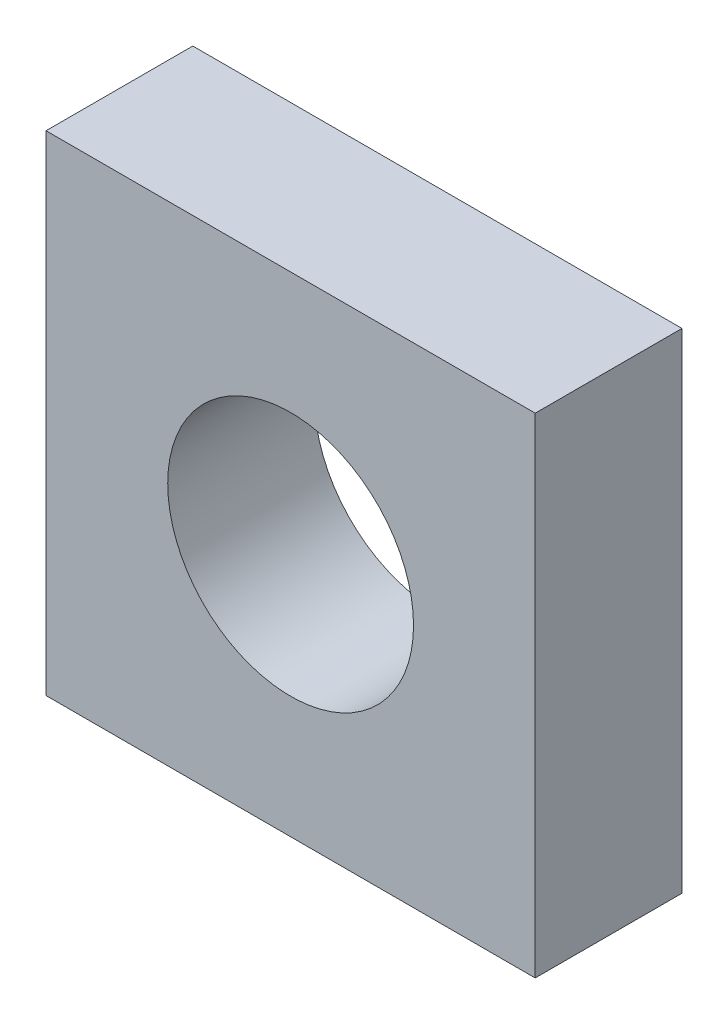
ISO-10303-21;
HEADER;
FILE_DESCRIPTION(('STEP AP214'),'2;1');
FILE_NAME('part.step','',(''),(''),'','','');
FILE_SCHEMA(('AUTOMOTIVE_DESIGN { 1 0 10303 214 1 1 1 1 }'));
ENDSEC;
DATA;
#1=APPLICATION_CONTEXT('core data for automotive mechanical design processes');
#2=APPLICATION_PROTOCOL_DEFINITION('international standard','automotive_design',2000,#1);
#3=PRODUCT_CONTEXT('',#1,'mechanical');
#4=PRODUCT('Part','Part','',(#3));
#5=PRODUCT_RELATED_PRODUCT_CATEGORY('part','',(#4));
#6=PRODUCT_DEFINITION_FORMATION('','',#4);
#7=PRODUCT_DEFINITION_CONTEXT('part definition',#1,'design');
#8=PRODUCT_DEFINITION('design','',#6,#7);
#9=PRODUCT_DEFINITION_SHAPE('','',#8);
#10=(LENGTH_UNIT() NAMED_UNIT(*) SI_UNIT(.MILLI.,.METRE.));
#11=(NAMED_UNIT(*) PLANE_ANGLE_UNIT() SI_UNIT($,.RADIAN.));
#12=(NAMED_UNIT(*) SI_UNIT($,.STERADIAN.) SOLID_ANGLE_UNIT());
#13=UNCERTAINTY_MEASURE_WITH_UNIT(LENGTH_MEASURE(1.E-05),#10,'distance_accuracy_value','');
#14=(GEOMETRIC_REPRESENTATION_CONTEXT(3) GLOBAL_UNCERTAINTY_ASSIGNED_CONTEXT((#13)) GLOBAL_UNIT_ASSIGNED_CONTEXT((#10,
#11,#12)) REPRESENTATION_CONTEXT('',''));
#15=CARTESIAN_POINT('',(0.,0.,0.));
#16=DIRECTION('',(0.,0.,1.));
#17=DIRECTION('',(1.,0.,0.));
#18=AXIS2_PLACEMENT_3D('',#15,#16,#17);
#19=CARTESIAN_POINT('',(-3.75989657792578,24.9081164522882,-12.6435302648991));
#20=DIRECTION('',(1.,0.,0.));
#21=DIRECTION('',(0.,1.,0.));
#22=AXIS2_PLACEMENT_3D('',#19,#20,#21);
#23=PLANE('',#22);
#24=DIRECTION('',(0.,-1.,0.));
#25=VECTOR('',#24,1.);
#26=CARTESIAN_POINT('',(-3.75989657792578,24.9081164522882,-15.6915302648991));
#27=LINE('',#26,#25);
#28=CARTESIAN_POINT('',(-3.75989657792578,24.9081164522882,-15.6915302648991));
#29=VERTEX_POINT('',#28);
#30=CARTESIAN_POINT('',(-3.75989657792577,14.7481164522882,-15.6915302648991));
#31=VERTEX_POINT('',#30);
#32=EDGE_CURVE('E79',#29,#31,#27,.T.);
#33=ORIENTED_EDGE('',*,*,#32,.T.);
#34=DIRECTION('',(0.,0.,-1.));
#35=VECTOR('',#34,1.);
#36=CARTESIAN_POINT('',(-3.75989657792577,14.7481164522882,-12.6435302648991));
#37=LINE('',#36,#35);
#38=CARTESIAN_POINT('',(-3.75989657792577,14.7481164522882,-12.6435302648991));
#39=VERTEX_POINT('',#38);
#40=EDGE_CURVE('E10',#39,#31,#37,.T.);
#41=ORIENTED_EDGE('',*,*,#40,.F.);
#42=DIRECTION('',(0.,-1.,0.));
#43=VECTOR('',#42,1.);
#44=CARTESIAN_POINT('',(-3.75989657792578,24.9081164522882,-12.6435302648991));
#45=LINE('',#44,#43);
#46=CARTESIAN_POINT('',(-3.75989657792578,24.9081164522882,-12.6435302648991));
#47=VERTEX_POINT('',#46);
#48=EDGE_CURVE('E67',#47,#39,#45,.T.);
#49=ORIENTED_EDGE('',*,*,#48,.F.);
#50=DIRECTION('',(0.,0.,-1.));
#51=VECTOR('',#50,1.);
#52=CARTESIAN_POINT('',(-3.75989657792578,24.9081164522882,-12.6435302648991));
#53=LINE('',#52,#51);
#54=EDGE_CURVE('E75',#47,#29,#53,.T.);
#55=ORIENTED_EDGE('',*,*,#54,.T.);
#56=EDGE_LOOP('',(#33,#41,#49,#55));
#57=FACE_BOUND('',#56,.T.);
#58=ADVANCED_FACE('F16',(#57),#23,.F.);
#59=CARTESIAN_POINT('',(-3.75989657792577,14.7481164522882,-12.6435302648991));
#60=DIRECTION('',(0.,1.,0.));
#61=DIRECTION('',(0.,0.,1.));
#62=AXIS2_PLACEMENT_3D('',#59,#60,#61);
#63=PLANE('',#62);
#64=DIRECTION('',(1.,0.,0.));
#65=VECTOR('',#64,1.);
#66=CARTESIAN_POINT('',(-3.75989657792577,14.7481164522882,-15.6915302648991));
#67=LINE('',#66,#65);
#68=CARTESIAN_POINT('',(6.40010342207423,14.7481164522882,-15.6915302648991));
#69=VERTEX_POINT('',#68);
#70=EDGE_CURVE('E71',#31,#69,#67,.T.);
#71=ORIENTED_EDGE('',*,*,#70,.T.);
#72=DIRECTION('',(0.,0.,-1.));
#73=VECTOR('',#72,1.);
#74=CARTESIAN_POINT('',(6.40010342207423,14.7481164522882,-12.6435302648991));
#75=LINE('',#74,#73);
#76=CARTESIAN_POINT('',(6.40010342207423,14.7481164522882,-12.6435302648991));
#77=VERTEX_POINT('',#76);
#78=EDGE_CURVE('E24',#77,#69,#75,.T.);
#79=ORIENTED_EDGE('',*,*,#78,.F.);
#80=DIRECTION('',(1.,0.,0.));
#81=VECTOR('',#80,1.);
#82=CARTESIAN_POINT('',(-3.75989657792577,14.7481164522882,-12.6435302648991));
#83=LINE('',#82,#81);
#84=EDGE_CURVE('E62',#39,#77,#83,.T.);
#85=ORIENTED_EDGE('',*,*,#84,.F.);
#86=ORIENTED_EDGE('',*,*,#40,.T.);
#87=EDGE_LOOP('',(#71,#79,#85,#86));
#88=FACE_BOUND('',#87,.T.);
#89=ADVANCED_FACE('F70',(#88),#63,.F.);
#90=CARTESIAN_POINT('',(6.40010342207423,24.9081164522882,-12.6435302648991));
#91=DIRECTION('',(-1.,0.,0.));
#92=DIRECTION('',(0.,-1.,0.));
#93=AXIS2_PLACEMENT_3D('',#90,#91,#92);
#94=PLANE('',#93);
#95=DIRECTION('',(0.,1.,0.));
#96=VECTOR('',#95,1.);
#97=CARTESIAN_POINT('',(6.40010342207423,24.9081164522882,-15.6915302648991));
#98=LINE('',#97,#96);
#99=CARTESIAN_POINT('',(6.40010342207423,24.9081164522882,-15.6915302648991));
#100=VERTEX_POINT('',#99);
#101=EDGE_CURVE('E49',#69,#100,#98,.T.);
#102=ORIENTED_EDGE('',*,*,#101,.T.);
#103=DIRECTION('',(0.,0.,-1.));
#104=VECTOR('',#103,1.);
#105=CARTESIAN_POINT('',(6.40010342207423,24.9081164522882,-12.6435302648991));
#106=LINE('',#105,#104);
#107=CARTESIAN_POINT('',(6.40010342207423,24.9081164522882,-12.6435302648991));
#108=VERTEX_POINT('',#107);
#109=EDGE_CURVE('E72',#108,#100,#106,.T.);
#110=ORIENTED_EDGE('',*,*,#109,.F.);
#111=DIRECTION('',(0.,1.,0.));
#112=VECTOR('',#111,1.);
#113=CARTESIAN_POINT('',(6.40010342207423,24.9081164522882,-12.6435302648991));
#114=LINE('',#113,#112);
#115=EDGE_CURVE('E65',#77,#108,#114,.T.);
#116=ORIENTED_EDGE('',*,*,#115,.F.);
#117=ORIENTED_EDGE('',*,*,#78,.T.);
#118=EDGE_LOOP('',(#102,#110,#116,#117));
#119=FACE_BOUND('',#118,.T.);
#120=ADVANCED_FACE('F73',(#119),#94,.F.);
#121=CARTESIAN_POINT('',(-3.75989657792578,24.9081164522882,-12.6435302648991));
#122=DIRECTION('',(0.,-1.,0.));
#123=DIRECTION('',(0.,0.,-1.));
#124=AXIS2_PLACEMENT_3D('',#121,#122,#123);
#125=PLANE('',#124);
#126=DIRECTION('',(-1.,0.,0.));
#127=VECTOR('',#126,1.);
#128=CARTESIAN_POINT('',(-3.75989657792578,24.9081164522882,-15.6915302648991));
#129=LINE('',#128,#127);
#130=EDGE_CURVE('E55',#100,#29,#129,.T.);
#131=ORIENTED_EDGE('',*,*,#130,.T.);
#132=ORIENTED_EDGE('',*,*,#54,.F.);
#133=DIRECTION('',(-1.,0.,0.));
#134=VECTOR('',#133,1.);
#135=CARTESIAN_POINT('',(-3.75989657792578,24.9081164522882,-12.6435302648991));
#136=LINE('',#135,#134);
#137=EDGE_CURVE('E32',#108,#47,#136,.T.);
#138=ORIENTED_EDGE('',*,*,#137,.F.);
#139=ORIENTED_EDGE('',*,*,#109,.T.);
#140=EDGE_LOOP('',(#131,#132,#138,#139));
#141=FACE_BOUND('',#140,.T.);
#142=ADVANCED_FACE('F87',(#141),#125,.F.);
#143=CARTESIAN_POINT('',(-3.75989657792577,14.7481164522882,-12.6435302648991));
#144=DIRECTION('',(0.,0.,1.));
#145=DIRECTION('',(1.,0.,0.));
#146=AXIS2_PLACEMENT_3D('',#143,#144,#145);
#147=PLANE('',#146);
#148=CARTESIAN_POINT('',(1.32010342207423,19.8281164522882,-12.6435302648991));
#149=DIRECTION('',(0.,0.,1.));
#150=DIRECTION('',(1.,0.,0.));
#151=AXIS2_PLACEMENT_3D('',#148,#149,#150);
#152=CIRCLE('',#151,2.55269999999999);
#153=CARTESIAN_POINT('',(3.87280342207421,19.8281164522882,-12.6435302648991));
#154=VERTEX_POINT('',#153);
#155=EDGE_CURVE('E95',#154,#154,#152,.T.);
#156=ORIENTED_EDGE('',*,*,#155,.F.);
#157=EDGE_LOOP('',(#156));
#158=FACE_BOUND('',#157,.T.);
#159=ORIENTED_EDGE('',*,*,#48,.T.);
#160=ORIENTED_EDGE('',*,*,#84,.T.);
#161=ORIENTED_EDGE('',*,*,#115,.T.);
#162=ORIENTED_EDGE('',*,*,#137,.T.);
#163=EDGE_LOOP('',(#159,#160,#161,#162));
#164=FACE_BOUND('',#163,.T.);
#165=ADVANCED_FACE('F63',(#158,#164),#147,.T.);
#166=CARTESIAN_POINT('',(-3.75989657792577,14.7481164522882,-15.6915302648991));
#167=DIRECTION('',(0.,0.,1.));
#168=DIRECTION('',(1.,0.,0.));
#169=AXIS2_PLACEMENT_3D('',#166,#167,#168);
#170=PLANE('',#169);
#171=CARTESIAN_POINT('',(1.32010342207423,19.8281164522882,-15.6915302648991));
#172=DIRECTION('',(0.,0.,1.));
#173=DIRECTION('',(1.,0.,0.));
#174=AXIS2_PLACEMENT_3D('',#171,#172,#173);
#175=CIRCLE('',#174,2.5527);
#176=CARTESIAN_POINT('',(3.87280342207423,19.8281164522882,-15.6915302648991));
#177=VERTEX_POINT('',#176);
#178=EDGE_CURVE('E82',#177,#177,#175,.T.);
#179=ORIENTED_EDGE('',*,*,#178,.T.);
#180=EDGE_LOOP('',(#179));
#181=FACE_BOUND('',#180,.T.);
#182=ORIENTED_EDGE('',*,*,#32,.F.);
#183=ORIENTED_EDGE('',*,*,#130,.F.);
#184=ORIENTED_EDGE('',*,*,#101,.F.);
#185=ORIENTED_EDGE('',*,*,#70,.F.);
#186=EDGE_LOOP('',(#182,#183,#184,#185));
#187=FACE_BOUND('',#186,.T.);
#188=ADVANCED_FACE('F90',(#181,#187),#170,.F.);
#189=CARTESIAN_POINT('',(1.32010342207423,19.8281164522882,-12.6435302648991));
#190=DIRECTION('',(0.,0.,1.));
#191=DIRECTION('',(1.,0.,0.));
#192=AXIS2_PLACEMENT_3D('',#189,#190,#191);
#193=CYLINDRICAL_SURFACE('',#192,2.55269999999999);
#194=ORIENTED_EDGE('',*,*,#178,.F.);
#195=EDGE_LOOP('',(#194));
#196=FACE_BOUND('',#195,.T.);
#197=ORIENTED_EDGE('',*,*,#155,.T.);
#198=EDGE_LOOP('',(#197));
#199=FACE_BOUND('',#198,.T.);
#200=ADVANCED_FACE('F99',(#196,#199),#193,.F.);
#201=CLOSED_SHELL('',(#58,#89,#120,#142,#165,#188,#200));
#202=MANIFOLD_SOLID_BREP('B1',#201);
#203=ADVANCED_BREP_SHAPE_REPRESENTATION('',(#18,#202),#14);
#204=SHAPE_DEFINITION_REPRESENTATION(#9,#203);
ENDSEC;
END-ISO-10303-21;
